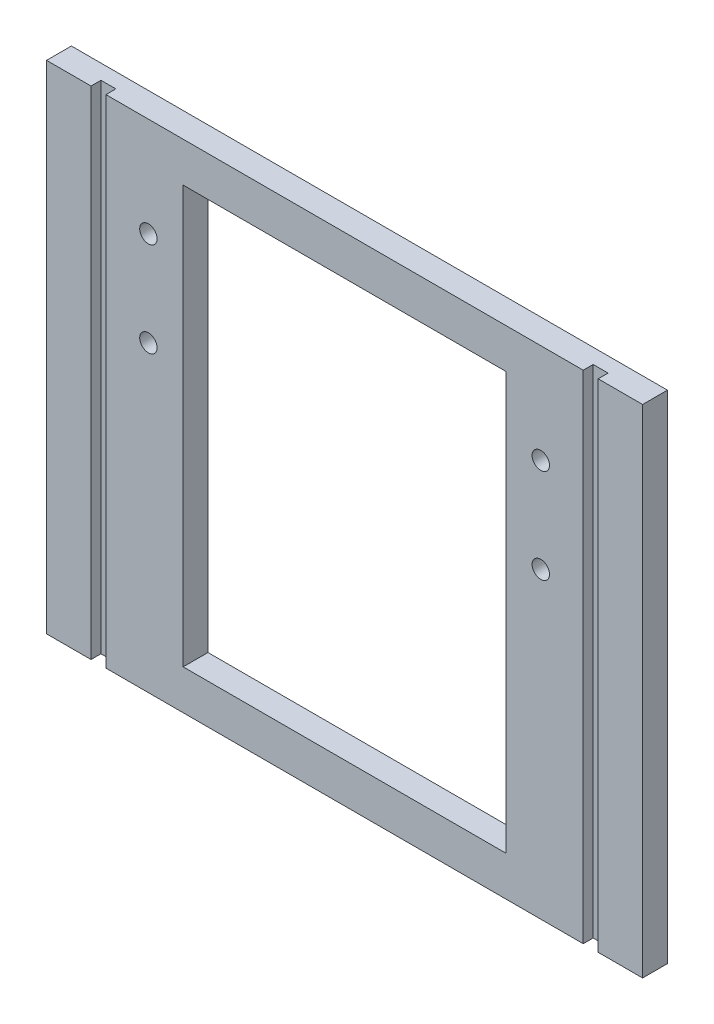
ISO-10303-21;
HEADER;
FILE_DESCRIPTION(('STEP AP214'),'2;1');
FILE_NAME('part.step','',(''),(''),'','','');
FILE_SCHEMA(('AUTOMOTIVE_DESIGN { 1 0 10303 214 1 1 1 1 }'));
ENDSEC;
DATA;
#1=APPLICATION_CONTEXT('core data for automotive mechanical design processes');
#2=APPLICATION_PROTOCOL_DEFINITION('international standard','automotive_design',2000,#1);
#3=PRODUCT_CONTEXT('',#1,'mechanical');
#4=PRODUCT('Part','Part','',(#3));
#5=PRODUCT_RELATED_PRODUCT_CATEGORY('part','',(#4));
#6=PRODUCT_DEFINITION_FORMATION('','',#4);
#7=PRODUCT_DEFINITION_CONTEXT('part definition',#1,'design');
#8=PRODUCT_DEFINITION('design','',#6,#7);
#9=PRODUCT_DEFINITION_SHAPE('','',#8);
#10=(LENGTH_UNIT() NAMED_UNIT(*) SI_UNIT(.MILLI.,.METRE.));
#11=(NAMED_UNIT(*) PLANE_ANGLE_UNIT() SI_UNIT($,.RADIAN.));
#12=(NAMED_UNIT(*) SI_UNIT($,.STERADIAN.) SOLID_ANGLE_UNIT());
#13=UNCERTAINTY_MEASURE_WITH_UNIT(LENGTH_MEASURE(1.E-05),#10,'distance_accuracy_value','');
#14=(GEOMETRIC_REPRESENTATION_CONTEXT(3) GLOBAL_UNCERTAINTY_ASSIGNED_CONTEXT((#13)) GLOBAL_UNIT_ASSIGNED_CONTEXT((#10,
#11,#12)) REPRESENTATION_CONTEXT('',''));
#15=CARTESIAN_POINT('',(0.,0.,0.));
#16=DIRECTION('',(0.,0.,1.));
#17=DIRECTION('',(1.,0.,0.));
#18=AXIS2_PLACEMENT_3D('',#15,#16,#17);
#19=CARTESIAN_POINT('',(0.,0.,5.));
#20=DIRECTION('',(0.,0.,-1.));
#21=DIRECTION('',(-1.,0.,0.));
#22=AXIS2_PLACEMENT_3D('',#19,#20,#21);
#23=PLANE('',#22);
#24=DIRECTION('',(1.,0.,0.));
#25=VECTOR('',#24,1.);
#26=CARTESIAN_POINT('',(0.,0.,5.));
#27=LINE('',#26,#25);
#28=CARTESIAN_POINT('',(0.,0.,5.));
#29=VERTEX_POINT('',#28);
#30=CARTESIAN_POINT('',(8.95000000000001,0.,5.));
#31=VERTEX_POINT('',#30);
#32=EDGE_CURVE('E267',#29,#31,#27,.T.);
#33=ORIENTED_EDGE('',*,*,#32,.T.);
#34=DIRECTION('',(0.,-1.,0.));
#35=VECTOR('',#34,1.);
#36=CARTESIAN_POINT('',(8.95,100.,5.));
#37=LINE('',#36,#35);
#38=CARTESIAN_POINT('',(8.95,100.,5.));
#39=VERTEX_POINT('',#38);
#40=EDGE_CURVE('E156',#39,#31,#37,.T.);
#41=ORIENTED_EDGE('',*,*,#40,.F.);
#42=DIRECTION('',(-1.,0.,0.));
#43=VECTOR('',#42,1.);
#44=CARTESIAN_POINT('',(0.,100.,5.));
#45=LINE('',#44,#43);
#46=CARTESIAN_POINT('',(0.,100.,5.));
#47=VERTEX_POINT('',#46);
#48=EDGE_CURVE('E272',#39,#47,#45,.T.);
#49=ORIENTED_EDGE('',*,*,#48,.T.);
#50=DIRECTION('',(0.,-1.,0.));
#51=VECTOR('',#50,1.);
#52=CARTESIAN_POINT('',(0.,0.,5.));
#53=LINE('',#52,#51);
#54=EDGE_CURVE('E262',#47,#29,#53,.T.);
#55=ORIENTED_EDGE('',*,*,#54,.T.);
#56=EDGE_LOOP('',(#33,#41,#49,#55));
#57=FACE_BOUND('',#56,.T.);
#58=ADVANCED_FACE('F37',(#57),#23,.F.);
#59=DIRECTION('',(0.,-1.,0.));
#60=VECTOR('',#59,1.);
#61=CARTESIAN_POINT('',(27.5,92.,5.));
#62=LINE('',#61,#60);
#63=CARTESIAN_POINT('',(27.5,92.,5.));
#64=VERTEX_POINT('',#63);
#65=CARTESIAN_POINT('',(27.5,8.,5.));
#66=VERTEX_POINT('',#65);
#67=EDGE_CURVE('E207',#64,#66,#62,.T.);
#68=ORIENTED_EDGE('',*,*,#67,.F.);
#69=DIRECTION('',(-1.,0.,0.));
#70=VECTOR('',#69,1.);
#71=CARTESIAN_POINT('',(27.5,92.,5.));
#72=LINE('',#71,#70);
#73=CARTESIAN_POINT('',(92.5,92.,5.));
#74=VERTEX_POINT('',#73);
#75=EDGE_CURVE('E215',#74,#64,#72,.T.);
#76=ORIENTED_EDGE('',*,*,#75,.F.);
#77=DIRECTION('',(0.,1.,0.));
#78=VECTOR('',#77,1.);
#79=CARTESIAN_POINT('',(92.5,92.,5.));
#80=LINE('',#79,#78);
#81=CARTESIAN_POINT('',(92.5,8.,5.));
#82=VERTEX_POINT('',#81);
#83=EDGE_CURVE('E212',#82,#74,#80,.T.);
#84=ORIENTED_EDGE('',*,*,#83,.F.);
#85=DIRECTION('',(1.,0.,0.));
#86=VECTOR('',#85,1.);
#87=CARTESIAN_POINT('',(27.5,8.,5.));
#88=LINE('',#87,#86);
#89=EDGE_CURVE('E209',#66,#82,#88,.T.);
#90=ORIENTED_EDGE('',*,*,#89,.F.);
#91=EDGE_LOOP('',(#68,#76,#84,#90));
#92=FACE_BOUND('',#91,.T.);
#93=CARTESIAN_POINT('',(20.5,80.,5.));
#94=DIRECTION('',(0.,0.,1.));
#95=DIRECTION('',(1.,0.,0.));
#96=AXIS2_PLACEMENT_3D('',#93,#94,#95);
#97=CIRCLE('',#96,1.75);
#98=CARTESIAN_POINT('',(22.25,80.,5.));
#99=VERTEX_POINT('',#98);
#100=EDGE_CURVE('E256',#99,#99,#97,.T.);
#101=ORIENTED_EDGE('',*,*,#100,.F.);
#102=EDGE_LOOP('',(#101));
#103=FACE_BOUND('',#102,.T.);
#104=CARTESIAN_POINT('',(20.5,61.,5.));
#105=DIRECTION('',(0.,0.,1.));
#106=DIRECTION('',(1.,0.,0.));
#107=AXIS2_PLACEMENT_3D('',#104,#105,#106);
#108=CIRCLE('',#107,1.75);
#109=CARTESIAN_POINT('',(22.25,61.,5.));
#110=VERTEX_POINT('',#109);
#111=EDGE_CURVE('E250',#110,#110,#108,.T.);
#112=ORIENTED_EDGE('',*,*,#111,.F.);
#113=EDGE_LOOP('',(#112));
#114=FACE_BOUND('',#113,.T.);
#115=CARTESIAN_POINT('',(99.5,80.,5.));
#116=DIRECTION('',(0.,0.,1.));
#117=DIRECTION('',(1.,0.,0.));
#118=AXIS2_PLACEMENT_3D('',#115,#116,#117);
#119=CIRCLE('',#118,1.75);
#120=CARTESIAN_POINT('',(101.25,80.,5.));
#121=VERTEX_POINT('',#120);
#122=EDGE_CURVE('E244',#121,#121,#119,.T.);
#123=ORIENTED_EDGE('',*,*,#122,.F.);
#124=EDGE_LOOP('',(#123));
#125=FACE_BOUND('',#124,.T.);
#126=CARTESIAN_POINT('',(99.5,61.,5.));
#127=DIRECTION('',(0.,0.,1.));
#128=DIRECTION('',(1.,0.,0.));
#129=AXIS2_PLACEMENT_3D('',#126,#127,#128);
#130=CIRCLE('',#129,1.75);
#131=CARTESIAN_POINT('',(101.25,61.,5.));
#132=VERTEX_POINT('',#131);
#133=EDGE_CURVE('E238',#132,#132,#130,.T.);
#134=ORIENTED_EDGE('',*,*,#133,.F.);
#135=EDGE_LOOP('',(#134));
#136=FACE_BOUND('',#135,.T.);
#137=CARTESIAN_POINT('',(108.05,100.,5.));
#138=VERTEX_POINT('',#137);
#139=CARTESIAN_POINT('',(11.95,100.,5.));
#140=VERTEX_POINT('',#139);
#141=EDGE_CURVE('E277',#138,#140,#45,.T.);
#142=ORIENTED_EDGE('',*,*,#141,.T.);
#143=DIRECTION('',(0.,1.,0.));
#144=VECTOR('',#143,1.);
#145=CARTESIAN_POINT('',(11.95,100.,5.));
#146=LINE('',#145,#144);
#147=CARTESIAN_POINT('',(11.95,0.,5.));
#148=VERTEX_POINT('',#147);
#149=EDGE_CURVE('E168',#148,#140,#146,.T.);
#150=ORIENTED_EDGE('',*,*,#149,.F.);
#151=CARTESIAN_POINT('',(108.05,0.,5.));
#152=VERTEX_POINT('',#151);
#153=EDGE_CURVE('E270',#148,#152,#27,.T.);
#154=ORIENTED_EDGE('',*,*,#153,.T.);
#155=DIRECTION('',(0.,-1.,0.));
#156=VECTOR('',#155,1.);
#157=CARTESIAN_POINT('',(108.05,100.,5.));
#158=LINE('',#157,#156);
#159=EDGE_CURVE('E196',#138,#152,#158,.T.);
#160=ORIENTED_EDGE('',*,*,#159,.F.);
#161=EDGE_LOOP('',(#142,#150,#154,#160));
#162=FACE_BOUND('',#161,.T.);
#163=ADVANCED_FACE('F316',(#92,#103,#114,#125,#136,#162),#23,.F.);
#164=CARTESIAN_POINT('',(120.,100.,5.));
#165=VERTEX_POINT('',#164);
#166=CARTESIAN_POINT('',(111.05,100.,5.));
#167=VERTEX_POINT('',#166);
#168=EDGE_CURVE('E273',#165,#167,#45,.T.);
#169=ORIENTED_EDGE('',*,*,#168,.T.);
#170=DIRECTION('',(0.,1.,0.));
#171=VECTOR('',#170,1.);
#172=CARTESIAN_POINT('',(111.05,100.,5.));
#173=LINE('',#172,#171);
#174=CARTESIAN_POINT('',(111.05,0.,5.));
#175=VERTEX_POINT('',#174);
#176=EDGE_CURVE('E190',#175,#167,#173,.T.);
#177=ORIENTED_EDGE('',*,*,#176,.F.);
#178=CARTESIAN_POINT('',(120.,0.,5.));
#179=VERTEX_POINT('',#178);
#180=EDGE_CURVE('E265',#175,#179,#27,.T.);
#181=ORIENTED_EDGE('',*,*,#180,.T.);
#182=DIRECTION('',(0.,1.,0.));
#183=VECTOR('',#182,1.);
#184=CARTESIAN_POINT('',(120.,0.,5.));
#185=LINE('',#184,#183);
#186=EDGE_CURVE('E269',#179,#165,#185,.T.);
#187=ORIENTED_EDGE('',*,*,#186,.T.);
#188=EDGE_LOOP('',(#169,#177,#181,#187));
#189=FACE_BOUND('',#188,.T.);
#190=ADVANCED_FACE('F333',(#189),#23,.F.);
#191=CARTESIAN_POINT('',(0.,0.,0.));
#192=DIRECTION('',(0.,0.,-1.));
#193=DIRECTION('',(-1.,0.,0.));
#194=AXIS2_PLACEMENT_3D('',#191,#192,#193);
#195=PLANE('',#194);
#196=CARTESIAN_POINT('',(99.5,80.,0.));
#197=DIRECTION('',(0.,0.,1.));
#198=DIRECTION('',(1.,0.,0.));
#199=AXIS2_PLACEMENT_3D('',#196,#197,#198);
#200=CIRCLE('',#199,1.75);
#201=CARTESIAN_POINT('',(101.25,80.,0.));
#202=VERTEX_POINT('',#201);
#203=EDGE_CURVE('E241',#202,#202,#200,.T.);
#204=ORIENTED_EDGE('',*,*,#203,.T.);
#205=EDGE_LOOP('',(#204));
#206=FACE_BOUND('',#205,.T.);
#207=CARTESIAN_POINT('',(20.5,80.,0.));
#208=DIRECTION('',(0.,0.,1.));
#209=DIRECTION('',(1.,0.,0.));
#210=AXIS2_PLACEMENT_3D('',#207,#208,#209);
#211=CIRCLE('',#210,1.75);
#212=CARTESIAN_POINT('',(22.25,80.,0.));
#213=VERTEX_POINT('',#212);
#214=EDGE_CURVE('E253',#213,#213,#211,.T.);
#215=ORIENTED_EDGE('',*,*,#214,.T.);
#216=EDGE_LOOP('',(#215));
#217=FACE_BOUND('',#216,.T.);
#218=DIRECTION('',(0.,-1.,0.));
#219=VECTOR('',#218,1.);
#220=CARTESIAN_POINT('',(0.,0.,0.));
#221=LINE('',#220,#219);
#222=CARTESIAN_POINT('',(0.,100.,0.));
#223=VERTEX_POINT('',#222);
#224=CARTESIAN_POINT('',(0.,0.,0.));
#225=VERTEX_POINT('',#224);
#226=EDGE_CURVE('E259',#223,#225,#221,.T.);
#227=ORIENTED_EDGE('',*,*,#226,.F.);
#228=DIRECTION('',(-1.,0.,0.));
#229=VECTOR('',#228,1.);
#230=CARTESIAN_POINT('',(0.,100.,0.));
#231=LINE('',#230,#229);
#232=CARTESIAN_POINT('',(120.,100.,0.));
#233=VERTEX_POINT('',#232);
#234=EDGE_CURVE('E266',#233,#223,#231,.T.);
#235=ORIENTED_EDGE('',*,*,#234,.F.);
#236=DIRECTION('',(0.,1.,0.));
#237=VECTOR('',#236,1.);
#238=CARTESIAN_POINT('',(120.,0.,0.));
#239=LINE('',#238,#237);
#240=CARTESIAN_POINT('',(120.,0.,0.));
#241=VERTEX_POINT('',#240);
#242=EDGE_CURVE('E282',#241,#233,#239,.T.);
#243=ORIENTED_EDGE('',*,*,#242,.F.);
#244=DIRECTION('',(1.,0.,0.));
#245=VECTOR('',#244,1.);
#246=CARTESIAN_POINT('',(0.,0.,0.));
#247=LINE('',#246,#245);
#248=EDGE_CURVE('E280',#225,#241,#247,.T.);
#249=ORIENTED_EDGE('',*,*,#248,.F.);
#250=EDGE_LOOP('',(#227,#235,#243,#249));
#251=FACE_BOUND('',#250,.T.);
#252=CARTESIAN_POINT('',(20.5,61.,0.));
#253=DIRECTION('',(0.,0.,1.));
#254=DIRECTION('',(1.,0.,0.));
#255=AXIS2_PLACEMENT_3D('',#252,#253,#254);
#256=CIRCLE('',#255,1.75);
#257=CARTESIAN_POINT('',(22.25,61.,0.));
#258=VERTEX_POINT('',#257);
#259=EDGE_CURVE('E247',#258,#258,#256,.T.);
#260=ORIENTED_EDGE('',*,*,#259,.T.);
#261=EDGE_LOOP('',(#260));
#262=FACE_BOUND('',#261,.T.);
#263=CARTESIAN_POINT('',(99.5,61.,0.));
#264=DIRECTION('',(0.,0.,1.));
#265=DIRECTION('',(1.,0.,0.));
#266=AXIS2_PLACEMENT_3D('',#263,#264,#265);
#267=CIRCLE('',#266,1.75);
#268=CARTESIAN_POINT('',(101.25,61.,0.));
#269=VERTEX_POINT('',#268);
#270=EDGE_CURVE('E237',#269,#269,#267,.T.);
#271=ORIENTED_EDGE('',*,*,#270,.T.);
#272=EDGE_LOOP('',(#271));
#273=FACE_BOUND('',#272,.T.);
#274=DIRECTION('',(-1.,0.,0.));
#275=VECTOR('',#274,1.);
#276=CARTESIAN_POINT('',(27.5,92.,0.));
#277=LINE('',#276,#275);
#278=CARTESIAN_POINT('',(92.5,92.,0.));
#279=VERTEX_POINT('',#278);
#280=CARTESIAN_POINT('',(27.5,92.,0.));
#281=VERTEX_POINT('',#280);
#282=EDGE_CURVE('E210',#279,#281,#277,.T.);
#283=ORIENTED_EDGE('',*,*,#282,.T.);
#284=DIRECTION('',(0.,-1.,0.));
#285=VECTOR('',#284,1.);
#286=CARTESIAN_POINT('',(27.5,92.,0.));
#287=LINE('',#286,#285);
#288=CARTESIAN_POINT('',(27.5,8.,0.));
#289=VERTEX_POINT('',#288);
#290=EDGE_CURVE('E181',#281,#289,#287,.T.);
#291=ORIENTED_EDGE('',*,*,#290,.T.);
#292=DIRECTION('',(1.,0.,0.));
#293=VECTOR('',#292,1.);
#294=CARTESIAN_POINT('',(27.5,8.,0.));
#295=LINE('',#294,#293);
#296=CARTESIAN_POINT('',(92.5,8.,0.));
#297=VERTEX_POINT('',#296);
#298=EDGE_CURVE('E220',#289,#297,#295,.T.);
#299=ORIENTED_EDGE('',*,*,#298,.T.);
#300=DIRECTION('',(0.,1.,0.));
#301=VECTOR('',#300,1.);
#302=CARTESIAN_POINT('',(92.5,92.,0.));
#303=LINE('',#302,#301);
#304=EDGE_CURVE('E223',#297,#279,#303,.T.);
#305=ORIENTED_EDGE('',*,*,#304,.T.);
#306=EDGE_LOOP('',(#283,#291,#299,#305));
#307=FACE_BOUND('',#306,.T.);
#308=ADVANCED_FACE('F300',(#206,#217,#251,#262,#273,#307),#195,.T.);
#309=CARTESIAN_POINT('',(0.,0.,5.));
#310=DIRECTION('',(1.,0.,0.));
#311=DIRECTION('',(0.,0.,-1.));
#312=AXIS2_PLACEMENT_3D('',#309,#310,#311);
#313=PLANE('',#312);
#314=ORIENTED_EDGE('',*,*,#226,.T.);
#315=DIRECTION('',(0.,0.,-1.));
#316=VECTOR('',#315,1.);
#317=CARTESIAN_POINT('',(0.,0.,5.));
#318=LINE('',#317,#316);
#319=EDGE_CURVE('E11',#29,#225,#318,.T.);
#320=ORIENTED_EDGE('',*,*,#319,.F.);
#321=ORIENTED_EDGE('',*,*,#54,.F.);
#322=DIRECTION('',(0.,0.,-1.));
#323=VECTOR('',#322,1.);
#324=CARTESIAN_POINT('',(0.,100.,5.));
#325=LINE('',#324,#323);
#326=EDGE_CURVE('E276',#47,#223,#325,.T.);
#327=ORIENTED_EDGE('',*,*,#326,.T.);
#328=EDGE_LOOP('',(#314,#320,#321,#327));
#329=FACE_BOUND('',#328,.T.);
#330=ADVANCED_FACE('F39',(#329),#313,.F.);
#331=CARTESIAN_POINT('',(0.,0.,5.));
#332=DIRECTION('',(0.,1.,0.));
#333=DIRECTION('',(0.,0.,1.));
#334=AXIS2_PLACEMENT_3D('',#331,#332,#333);
#335=PLANE('',#334);
#336=DIRECTION('',(1.,0.,0.));
#337=VECTOR('',#336,1.);
#338=CARTESIAN_POINT('',(8.95000000000001,0.,3.));
#339=LINE('',#338,#337);
#340=CARTESIAN_POINT('',(8.95000000000001,0.,3.));
#341=VERTEX_POINT('',#340);
#342=CARTESIAN_POINT('',(11.95,0.,3.));
#343=VERTEX_POINT('',#342);
#344=EDGE_CURVE('E164',#341,#343,#339,.T.);
#345=ORIENTED_EDGE('',*,*,#344,.F.);
#346=DIRECTION('',(0.,0.,1.));
#347=VECTOR('',#346,1.);
#348=CARTESIAN_POINT('',(8.95000000000001,0.,3.));
#349=LINE('',#348,#347);
#350=EDGE_CURVE('E151',#341,#31,#349,.T.);
#351=ORIENTED_EDGE('',*,*,#350,.T.);
#352=ORIENTED_EDGE('',*,*,#32,.F.);
#353=ORIENTED_EDGE('',*,*,#319,.T.);
#354=ORIENTED_EDGE('',*,*,#248,.T.);
#355=DIRECTION('',(0.,0.,-1.));
#356=VECTOR('',#355,1.);
#357=CARTESIAN_POINT('',(120.,0.,5.));
#358=LINE('',#357,#356);
#359=EDGE_CURVE('E45',#179,#241,#358,.T.);
#360=ORIENTED_EDGE('',*,*,#359,.F.);
#361=ORIENTED_EDGE('',*,*,#180,.F.);
#362=DIRECTION('',(0.,0.,1.));
#363=VECTOR('',#362,1.);
#364=CARTESIAN_POINT('',(111.05,0.,3.));
#365=LINE('',#364,#363);
#366=CARTESIAN_POINT('',(111.05,0.,3.));
#367=VERTEX_POINT('',#366);
#368=EDGE_CURVE('E203',#367,#175,#365,.T.);
#369=ORIENTED_EDGE('',*,*,#368,.F.);
#370=DIRECTION('',(1.,0.,0.));
#371=VECTOR('',#370,1.);
#372=CARTESIAN_POINT('',(108.05,0.,3.));
#373=LINE('',#372,#371);
#374=CARTESIAN_POINT('',(108.05,0.,3.));
#375=VERTEX_POINT('',#374);
#376=EDGE_CURVE('E189',#375,#367,#373,.T.);
#377=ORIENTED_EDGE('',*,*,#376,.F.);
#378=DIRECTION('',(0.,0.,1.));
#379=VECTOR('',#378,1.);
#380=CARTESIAN_POINT('',(108.05,0.,3.));
#381=LINE('',#380,#379);
#382=EDGE_CURVE('E195',#375,#152,#381,.T.);
#383=ORIENTED_EDGE('',*,*,#382,.T.);
#384=ORIENTED_EDGE('',*,*,#153,.F.);
#385=DIRECTION('',(0.,0.,1.));
#386=VECTOR('',#385,1.);
#387=CARTESIAN_POINT('',(11.95,0.,3.));
#388=LINE('',#387,#386);
#389=EDGE_CURVE('E160',#343,#148,#388,.T.);
#390=ORIENTED_EDGE('',*,*,#389,.F.);
#391=EDGE_LOOP('',(#345,#351,#352,#353,#354,#360,#361,#369,#377,#383,#384,#390));
#392=FACE_BOUND('',#391,.T.);
#393=ADVANCED_FACE('F170',(#392),#335,.F.);
#394=CARTESIAN_POINT('',(120.,0.,5.));
#395=DIRECTION('',(-1.,0.,0.));
#396=DIRECTION('',(0.,0.,1.));
#397=AXIS2_PLACEMENT_3D('',#394,#395,#396);
#398=PLANE('',#397);
#399=ORIENTED_EDGE('',*,*,#242,.T.);
#400=DIRECTION('',(0.,0.,-1.));
#401=VECTOR('',#400,1.);
#402=CARTESIAN_POINT('',(120.,100.,5.));
#403=LINE('',#402,#401);
#404=EDGE_CURVE('E287',#165,#233,#403,.T.);
#405=ORIENTED_EDGE('',*,*,#404,.F.);
#406=ORIENTED_EDGE('',*,*,#186,.F.);
#407=ORIENTED_EDGE('',*,*,#359,.T.);
#408=EDGE_LOOP('',(#399,#405,#406,#407));
#409=FACE_BOUND('',#408,.T.);
#410=ADVANCED_FACE('F294',(#409),#398,.F.);
#411=CARTESIAN_POINT('',(0.,100.,5.));
#412=DIRECTION('',(0.,-1.,0.));
#413=DIRECTION('',(0.,0.,-1.));
#414=AXIS2_PLACEMENT_3D('',#411,#412,#413);
#415=PLANE('',#414);
#416=ORIENTED_EDGE('',*,*,#48,.F.);
#417=DIRECTION('',(0.,0.,1.));
#418=VECTOR('',#417,1.);
#419=CARTESIAN_POINT('',(8.95,100.,3.));
#420=LINE('',#419,#418);
#421=CARTESIAN_POINT('',(8.95,100.,3.));
#422=VERTEX_POINT('',#421);
#423=EDGE_CURVE('E179',#422,#39,#420,.T.);
#424=ORIENTED_EDGE('',*,*,#423,.F.);
#425=DIRECTION('',(-1.,0.,0.));
#426=VECTOR('',#425,1.);
#427=CARTESIAN_POINT('',(8.95,100.,3.));
#428=LINE('',#427,#426);
#429=CARTESIAN_POINT('',(11.95,100.,3.));
#430=VERTEX_POINT('',#429);
#431=EDGE_CURVE('E161',#430,#422,#428,.T.);
#432=ORIENTED_EDGE('',*,*,#431,.F.);
#433=DIRECTION('',(0.,0.,1.));
#434=VECTOR('',#433,1.);
#435=CARTESIAN_POINT('',(11.95,100.,3.));
#436=LINE('',#435,#434);
#437=EDGE_CURVE('E182',#430,#140,#436,.T.);
#438=ORIENTED_EDGE('',*,*,#437,.T.);
#439=ORIENTED_EDGE('',*,*,#141,.F.);
#440=DIRECTION('',(0.,0.,1.));
#441=VECTOR('',#440,1.);
#442=CARTESIAN_POINT('',(108.05,100.,3.));
#443=LINE('',#442,#441);
#444=CARTESIAN_POINT('',(108.05,100.,3.));
#445=VERTEX_POINT('',#444);
#446=EDGE_CURVE('E177',#445,#138,#443,.T.);
#447=ORIENTED_EDGE('',*,*,#446,.F.);
#448=DIRECTION('',(-1.,0.,0.));
#449=VECTOR('',#448,1.);
#450=CARTESIAN_POINT('',(108.05,100.,3.));
#451=LINE('',#450,#449);
#452=CARTESIAN_POINT('',(111.05,100.,3.));
#453=VERTEX_POINT('',#452);
#454=EDGE_CURVE('E193',#453,#445,#451,.T.);
#455=ORIENTED_EDGE('',*,*,#454,.F.);
#456=DIRECTION('',(0.,0.,1.));
#457=VECTOR('',#456,1.);
#458=CARTESIAN_POINT('',(111.05,100.,3.));
#459=LINE('',#458,#457);
#460=EDGE_CURVE('E200',#453,#167,#459,.T.);
#461=ORIENTED_EDGE('',*,*,#460,.T.);
#462=ORIENTED_EDGE('',*,*,#168,.F.);
#463=ORIENTED_EDGE('',*,*,#404,.T.);
#464=ORIENTED_EDGE('',*,*,#234,.T.);
#465=ORIENTED_EDGE('',*,*,#326,.F.);
#466=EDGE_LOOP('',(#416,#424,#432,#438,#439,#447,#455,#461,#462,#463,#464,#465));
#467=FACE_BOUND('',#466,.T.);
#468=ADVANCED_FACE('F305',(#467),#415,.F.);
#469=CARTESIAN_POINT('',(20.5,80.,5.));
#470=DIRECTION('',(0.,0.,-1.));
#471=DIRECTION('',(-1.,0.,0.));
#472=AXIS2_PLACEMENT_3D('',#469,#470,#471);
#473=CYLINDRICAL_SURFACE('',#472,1.75);
#474=ORIENTED_EDGE('',*,*,#100,.T.);
#475=EDGE_LOOP('',(#474));
#476=FACE_BOUND('',#475,.T.);
#477=ORIENTED_EDGE('',*,*,#214,.F.);
#478=EDGE_LOOP('',(#477));
#479=FACE_BOUND('',#478,.T.);
#480=ADVANCED_FACE('F388',(#476,#479),#473,.F.);
#481=CARTESIAN_POINT('',(20.5,61.,5.));
#482=DIRECTION('',(0.,0.,-1.));
#483=DIRECTION('',(-1.,0.,0.));
#484=AXIS2_PLACEMENT_3D('',#481,#482,#483);
#485=CYLINDRICAL_SURFACE('',#484,1.75);
#486=ORIENTED_EDGE('',*,*,#111,.T.);
#487=EDGE_LOOP('',(#486));
#488=FACE_BOUND('',#487,.T.);
#489=ORIENTED_EDGE('',*,*,#259,.F.);
#490=EDGE_LOOP('',(#489));
#491=FACE_BOUND('',#490,.T.);
#492=ADVANCED_FACE('F385',(#488,#491),#485,.F.);
#493=CARTESIAN_POINT('',(99.5,80.,5.));
#494=DIRECTION('',(0.,0.,-1.));
#495=DIRECTION('',(-1.,0.,0.));
#496=AXIS2_PLACEMENT_3D('',#493,#494,#495);
#497=CYLINDRICAL_SURFACE('',#496,1.75);
#498=ORIENTED_EDGE('',*,*,#122,.T.);
#499=EDGE_LOOP('',(#498));
#500=FACE_BOUND('',#499,.T.);
#501=ORIENTED_EDGE('',*,*,#203,.F.);
#502=EDGE_LOOP('',(#501));
#503=FACE_BOUND('',#502,.T.);
#504=ADVANCED_FACE('F381',(#500,#503),#497,.F.);
#505=CARTESIAN_POINT('',(99.5,61.,5.));
#506=DIRECTION('',(0.,0.,-1.));
#507=DIRECTION('',(-1.,0.,0.));
#508=AXIS2_PLACEMENT_3D('',#505,#506,#507);
#509=CYLINDRICAL_SURFACE('',#508,1.75);
#510=ORIENTED_EDGE('',*,*,#133,.T.);
#511=EDGE_LOOP('',(#510));
#512=FACE_BOUND('',#511,.T.);
#513=ORIENTED_EDGE('',*,*,#270,.F.);
#514=EDGE_LOOP('',(#513));
#515=FACE_BOUND('',#514,.T.);
#516=ADVANCED_FACE('F377',(#512,#515),#509,.F.);
#517=CARTESIAN_POINT('',(27.5,92.,5.));
#518=DIRECTION('',(1.,0.,0.));
#519=DIRECTION('',(0.,1.,0.));
#520=AXIS2_PLACEMENT_3D('',#517,#518,#519);
#521=PLANE('',#520);
#522=ORIENTED_EDGE('',*,*,#290,.F.);
#523=DIRECTION('',(0.,0.,-1.));
#524=VECTOR('',#523,1.);
#525=CARTESIAN_POINT('',(27.5,92.,5.));
#526=LINE('',#525,#524);
#527=EDGE_CURVE('E217',#64,#281,#526,.T.);
#528=ORIENTED_EDGE('',*,*,#527,.F.);
#529=ORIENTED_EDGE('',*,*,#67,.T.);
#530=DIRECTION('',(0.,0.,-1.));
#531=VECTOR('',#530,1.);
#532=CARTESIAN_POINT('',(27.5,8.,5.));
#533=LINE('',#532,#531);
#534=EDGE_CURVE('E234',#66,#289,#533,.T.);
#535=ORIENTED_EDGE('',*,*,#534,.T.);
#536=EDGE_LOOP('',(#522,#528,#529,#535));
#537=FACE_BOUND('',#536,.T.);
#538=ADVANCED_FACE('F373',(#537),#521,.T.);
#539=CARTESIAN_POINT('',(27.5,8.,5.));
#540=DIRECTION('',(0.,1.,0.));
#541=DIRECTION('',(0.,0.,1.));
#542=AXIS2_PLACEMENT_3D('',#539,#540,#541);
#543=PLANE('',#542);
#544=ORIENTED_EDGE('',*,*,#298,.F.);
#545=ORIENTED_EDGE('',*,*,#534,.F.);
#546=ORIENTED_EDGE('',*,*,#89,.T.);
#547=DIRECTION('',(0.,0.,-1.));
#548=VECTOR('',#547,1.);
#549=CARTESIAN_POINT('',(92.5,8.,5.));
#550=LINE('',#549,#548);
#551=EDGE_CURVE('E232',#82,#297,#550,.T.);
#552=ORIENTED_EDGE('',*,*,#551,.T.);
#553=EDGE_LOOP('',(#544,#545,#546,#552));
#554=FACE_BOUND('',#553,.T.);
#555=ADVANCED_FACE('F369',(#554),#543,.T.);
#556=CARTESIAN_POINT('',(92.5,92.,5.));
#557=DIRECTION('',(-1.,0.,0.));
#558=DIRECTION('',(0.,-1.,0.));
#559=AXIS2_PLACEMENT_3D('',#556,#557,#558);
#560=PLANE('',#559);
#561=ORIENTED_EDGE('',*,*,#304,.F.);
#562=ORIENTED_EDGE('',*,*,#551,.F.);
#563=ORIENTED_EDGE('',*,*,#83,.T.);
#564=DIRECTION('',(0.,0.,-1.));
#565=VECTOR('',#564,1.);
#566=CARTESIAN_POINT('',(92.5,92.,5.));
#567=LINE('',#566,#565);
#568=EDGE_CURVE('E230',#74,#279,#567,.T.);
#569=ORIENTED_EDGE('',*,*,#568,.T.);
#570=EDGE_LOOP('',(#561,#562,#563,#569));
#571=FACE_BOUND('',#570,.T.);
#572=ADVANCED_FACE('F365',(#571),#560,.T.);
#573=CARTESIAN_POINT('',(27.5,92.,5.));
#574=DIRECTION('',(0.,-1.,0.));
#575=DIRECTION('',(0.,0.,-1.));
#576=AXIS2_PLACEMENT_3D('',#573,#574,#575);
#577=PLANE('',#576);
#578=ORIENTED_EDGE('',*,*,#282,.F.);
#579=ORIENTED_EDGE('',*,*,#568,.F.);
#580=ORIENTED_EDGE('',*,*,#75,.T.);
#581=ORIENTED_EDGE('',*,*,#527,.T.);
#582=EDGE_LOOP('',(#578,#579,#580,#581));
#583=FACE_BOUND('',#582,.T.);
#584=ADVANCED_FACE('F362',(#583),#577,.T.);
#585=CARTESIAN_POINT('',(108.05,100.,3.));
#586=DIRECTION('',(-1.,0.,0.));
#587=DIRECTION('',(0.,-1.,0.));
#588=AXIS2_PLACEMENT_3D('',#585,#586,#587);
#589=PLANE('',#588);
#590=ORIENTED_EDGE('',*,*,#159,.T.);
#591=ORIENTED_EDGE('',*,*,#382,.F.);
#592=DIRECTION('',(0.,-1.,0.));
#593=VECTOR('',#592,1.);
#594=CARTESIAN_POINT('',(108.05,100.,3.));
#595=LINE('',#594,#593);
#596=EDGE_CURVE('E186',#445,#375,#595,.T.);
#597=ORIENTED_EDGE('',*,*,#596,.F.);
#598=ORIENTED_EDGE('',*,*,#446,.T.);
#599=EDGE_LOOP('',(#590,#591,#597,#598));
#600=FACE_BOUND('',#599,.T.);
#601=ADVANCED_FACE('F352',(#600),#589,.F.);
#602=CARTESIAN_POINT('',(111.05,100.,3.));
#603=DIRECTION('',(1.,0.,0.));
#604=DIRECTION('',(0.,1.,0.));
#605=AXIS2_PLACEMENT_3D('',#602,#603,#604);
#606=PLANE('',#605);
#607=ORIENTED_EDGE('',*,*,#176,.T.);
#608=ORIENTED_EDGE('',*,*,#460,.F.);
#609=DIRECTION('',(0.,1.,0.));
#610=VECTOR('',#609,1.);
#611=CARTESIAN_POINT('',(111.05,100.,3.));
#612=LINE('',#611,#610);
#613=EDGE_CURVE('E60',#367,#453,#612,.T.);
#614=ORIENTED_EDGE('',*,*,#613,.F.);
#615=ORIENTED_EDGE('',*,*,#368,.T.);
#616=EDGE_LOOP('',(#607,#608,#614,#615));
#617=FACE_BOUND('',#616,.T.);
#618=ADVANCED_FACE('F348',(#617),#606,.F.);
#619=CARTESIAN_POINT('',(0.,0.,3.));
#620=DIRECTION('',(0.,0.,1.));
#621=DIRECTION('',(1.,0.,0.));
#622=AXIS2_PLACEMENT_3D('',#619,#620,#621);
#623=PLANE('',#622);
#624=ORIENTED_EDGE('',*,*,#596,.T.);
#625=ORIENTED_EDGE('',*,*,#376,.T.);
#626=ORIENTED_EDGE('',*,*,#613,.T.);
#627=ORIENTED_EDGE('',*,*,#454,.T.);
#628=EDGE_LOOP('',(#624,#625,#626,#627));
#629=FACE_BOUND('',#628,.T.);
#630=ADVANCED_FACE('F329',(#629),#623,.T.);
#631=CARTESIAN_POINT('',(8.95,100.,3.));
#632=DIRECTION('',(-1.,0.,0.));
#633=DIRECTION('',(0.,-1.,0.));
#634=AXIS2_PLACEMENT_3D('',#631,#632,#633);
#635=PLANE('',#634);
#636=ORIENTED_EDGE('',*,*,#40,.T.);
#637=ORIENTED_EDGE('',*,*,#350,.F.);
#638=DIRECTION('',(0.,-1.,0.));
#639=VECTOR('',#638,1.);
#640=CARTESIAN_POINT('',(8.95,100.,3.));
#641=LINE('',#640,#639);
#642=EDGE_CURVE('E154',#422,#341,#641,.T.);
#643=ORIENTED_EDGE('',*,*,#642,.F.);
#644=ORIENTED_EDGE('',*,*,#423,.T.);
#645=EDGE_LOOP('',(#636,#637,#643,#644));
#646=FACE_BOUND('',#645,.T.);
#647=ADVANCED_FACE('F153',(#646),#635,.F.);
#648=CARTESIAN_POINT('',(11.95,100.,3.));
#649=DIRECTION('',(1.,0.,0.));
#650=DIRECTION('',(0.,1.,0.));
#651=AXIS2_PLACEMENT_3D('',#648,#649,#650);
#652=PLANE('',#651);
#653=ORIENTED_EDGE('',*,*,#149,.T.);
#654=ORIENTED_EDGE('',*,*,#437,.F.);
#655=DIRECTION('',(0.,1.,0.));
#656=VECTOR('',#655,1.);
#657=CARTESIAN_POINT('',(11.95,100.,3.));
#658=LINE('',#657,#656);
#659=EDGE_CURVE('E52',#343,#430,#658,.T.);
#660=ORIENTED_EDGE('',*,*,#659,.F.);
#661=ORIENTED_EDGE('',*,*,#389,.T.);
#662=EDGE_LOOP('',(#653,#654,#660,#661));
#663=FACE_BOUND('',#662,.T.);
#664=ADVANCED_FACE('F321',(#663),#652,.F.);
#665=CARTESIAN_POINT('',(0.,0.,3.));
#666=DIRECTION('',(0.,0.,1.));
#667=DIRECTION('',(1.,0.,0.));
#668=AXIS2_PLACEMENT_3D('',#665,#666,#667);
#669=PLANE('',#668);
#670=ORIENTED_EDGE('',*,*,#642,.T.);
#671=ORIENTED_EDGE('',*,*,#344,.T.);
#672=ORIENTED_EDGE('',*,*,#659,.T.);
#673=ORIENTED_EDGE('',*,*,#431,.T.);
#674=EDGE_LOOP('',(#670,#671,#672,#673));
#675=FACE_BOUND('',#674,.T.);
#676=ADVANCED_FACE('F163',(#675),#669,.T.);
#677=CLOSED_SHELL('',(#58,#163,#190,#308,#330,#393,#410,#468,#480,#492,#504,#516,#538,#555,#572,
#584,#601,#618,#630,#647,#664,#676));
#678=MANIFOLD_SOLID_BREP('B2',#677);
#679=ADVANCED_BREP_SHAPE_REPRESENTATION('',(#18,#678),#14);
#680=SHAPE_DEFINITION_REPRESENTATION(#9,#679);
ENDSEC;
END-ISO-10303-21;
